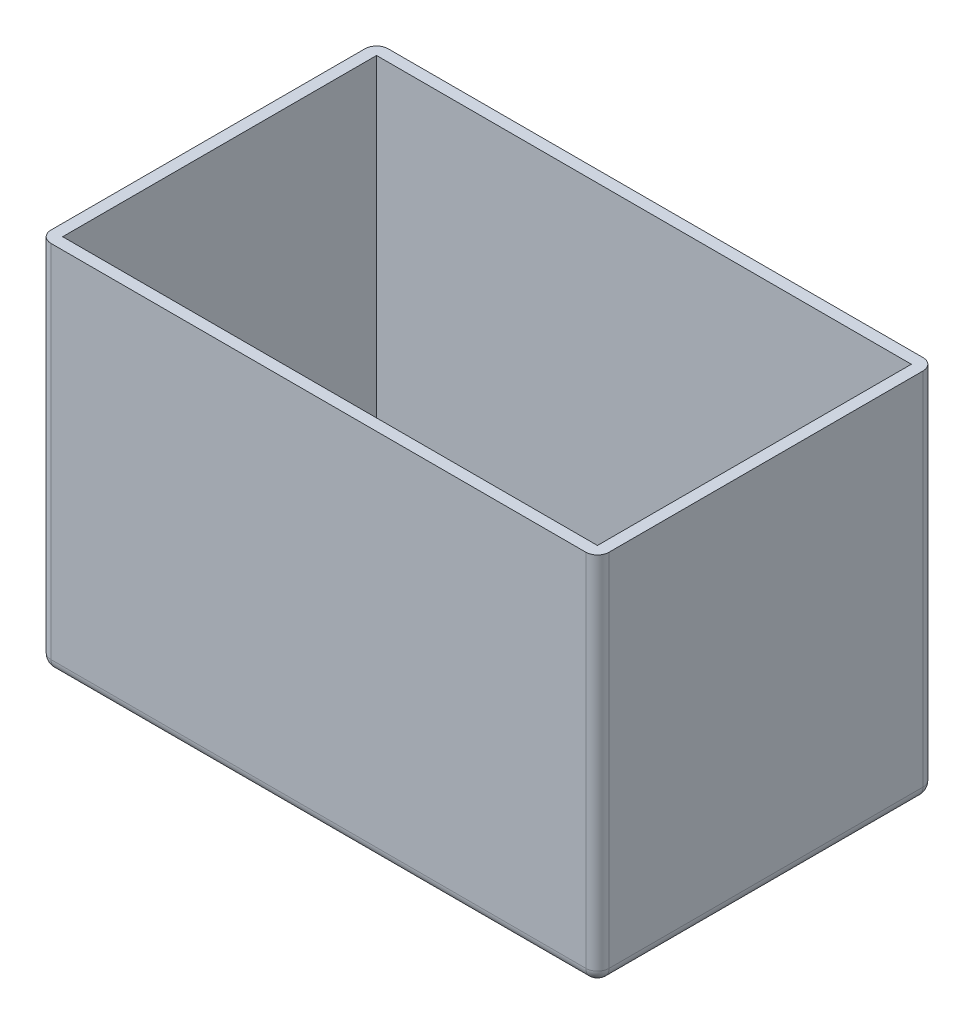
ISO-10303-21;
HEADER;
FILE_DESCRIPTION(('STEP AP214'),'2;1');
FILE_NAME('part.step','',(''),(''),'','','');
FILE_SCHEMA(('AUTOMOTIVE_DESIGN { 1 0 10303 214 1 1 1 1 }'));
ENDSEC;
DATA;
#1=APPLICATION_CONTEXT('core data for automotive mechanical design processes');
#2=APPLICATION_PROTOCOL_DEFINITION('international standard','automotive_design',2000,#1);
#3=PRODUCT_CONTEXT('',#1,'mechanical');
#4=PRODUCT('Part','Part','',(#3));
#5=PRODUCT_RELATED_PRODUCT_CATEGORY('part','',(#4));
#6=PRODUCT_DEFINITION_FORMATION('','',#4);
#7=PRODUCT_DEFINITION_CONTEXT('part definition',#1,'design');
#8=PRODUCT_DEFINITION('design','',#6,#7);
#9=PRODUCT_DEFINITION_SHAPE('','',#8);
#10=(LENGTH_UNIT() NAMED_UNIT(*) SI_UNIT(.MILLI.,.METRE.));
#11=(NAMED_UNIT(*) PLANE_ANGLE_UNIT() SI_UNIT($,.RADIAN.));
#12=(NAMED_UNIT(*) SI_UNIT($,.STERADIAN.) SOLID_ANGLE_UNIT());
#13=UNCERTAINTY_MEASURE_WITH_UNIT(LENGTH_MEASURE(1.E-05),#10,'distance_accuracy_value','');
#14=(GEOMETRIC_REPRESENTATION_CONTEXT(3) GLOBAL_UNCERTAINTY_ASSIGNED_CONTEXT((#13)) GLOBAL_UNIT_ASSIGNED_CONTEXT((#10,
#11,#12)) REPRESENTATION_CONTEXT('',''));
#15=CARTESIAN_POINT('',(0.,0.,0.));
#16=DIRECTION('',(0.,0.,1.));
#17=DIRECTION('',(1.,0.,0.));
#18=AXIS2_PLACEMENT_3D('',#15,#16,#17);
#19=CARTESIAN_POINT('',(-32.7097276422764,32.,-26.44775));
#20=DIRECTION('',(1.,0.,0.));
#21=DIRECTION('',(0.,0.,-1.));
#22=AXIS2_PLACEMENT_3D('',#19,#20,#21);
#23=PLANE('',#22);
#24=DIRECTION('',(0.,0.,1.));
#25=VECTOR('',#24,1.);
#26=CARTESIAN_POINT('',(-32.7097276422764,1.,-26.44775));
#27=LINE('',#26,#25);
#28=CARTESIAN_POINT('',(-32.7097276422764,1.,-54.44775));
#29=VERTEX_POINT('',#28);
#30=CARTESIAN_POINT('',(-32.7097276422764,1.,-27.44775));
#31=VERTEX_POINT('',#30);
#32=EDGE_CURVE('E192',#29,#31,#27,.T.);
#33=ORIENTED_EDGE('',*,*,#32,.T.);
#34=DIRECTION('',(0.,-1.,0.));
#35=VECTOR('',#34,1.);
#36=CARTESIAN_POINT('',(-32.7097276422764,32.,-27.44775));
#37=LINE('',#36,#35);
#38=CARTESIAN_POINT('',(-32.7097276422764,32.,-27.44775));
#39=VERTEX_POINT('',#38);
#40=EDGE_CURVE('E195',#31,#39,#37,.F.);
#41=ORIENTED_EDGE('',*,*,#40,.T.);
#42=DIRECTION('',(0.,0.,1.));
#43=VECTOR('',#42,1.);
#44=CARTESIAN_POINT('',(-32.7097276422764,32.,-26.44775));
#45=LINE('',#44,#43);
#46=CARTESIAN_POINT('',(-32.7097276422764,32.,-54.44775));
#47=VERTEX_POINT('',#46);
#48=EDGE_CURVE('E175',#47,#39,#45,.T.);
#49=ORIENTED_EDGE('',*,*,#48,.F.);
#50=DIRECTION('',(0.,-1.,0.));
#51=VECTOR('',#50,1.);
#52=CARTESIAN_POINT('',(-32.7097276422764,32.,-54.44775));
#53=LINE('',#52,#51);
#54=EDGE_CURVE('E190',#47,#29,#53,.T.);
#55=ORIENTED_EDGE('',*,*,#54,.T.);
#56=EDGE_LOOP('',(#33,#41,#49,#55));
#57=FACE_BOUND('',#56,.T.);
#58=ADVANCED_FACE('F33',(#57),#23,.F.);
#59=CARTESIAN_POINT('',(-32.7097276422764,32.,-26.44775));
#60=DIRECTION('',(0.,0.,-1.));
#61=DIRECTION('',(-1.,0.,0.));
#62=AXIS2_PLACEMENT_3D('',#59,#60,#61);
#63=PLANE('',#62);
#64=DIRECTION('',(1.,0.,0.));
#65=VECTOR('',#64,1.);
#66=CARTESIAN_POINT('',(15.2902723577236,1.,-26.44775));
#67=LINE('',#66,#65);
#68=CARTESIAN_POINT('',(-31.7097276422764,1.,-26.44775));
#69=VERTEX_POINT('',#68);
#70=CARTESIAN_POINT('',(14.2902723577236,1.,-26.44775));
#71=VERTEX_POINT('',#70);
#72=EDGE_CURVE('E50',#69,#71,#67,.T.);
#73=ORIENTED_EDGE('',*,*,#72,.T.);
#74=DIRECTION('',(0.,-1.,0.));
#75=VECTOR('',#74,1.);
#76=CARTESIAN_POINT('',(14.2902723577236,32.,-26.44775));
#77=LINE('',#76,#75);
#78=CARTESIAN_POINT('',(14.2902723577236,32.,-26.44775));
#79=VERTEX_POINT('',#78);
#80=EDGE_CURVE('E220',#71,#79,#77,.F.);
#81=ORIENTED_EDGE('',*,*,#80,.T.);
#82=DIRECTION('',(1.,0.,0.));
#83=VECTOR('',#82,1.);
#84=CARTESIAN_POINT('',(-32.7097276422764,32.,-26.44775));
#85=LINE('',#84,#83);
#86=CARTESIAN_POINT('',(-31.7097276422764,32.,-26.44775));
#87=VERTEX_POINT('',#86);
#88=EDGE_CURVE('E181',#87,#79,#85,.T.);
#89=ORIENTED_EDGE('',*,*,#88,.F.);
#90=DIRECTION('',(0.,-1.,0.));
#91=VECTOR('',#90,1.);
#92=CARTESIAN_POINT('',(-31.7097276422764,32.,-26.44775));
#93=LINE('',#92,#91);
#94=EDGE_CURVE('E55',#87,#69,#93,.T.);
#95=ORIENTED_EDGE('',*,*,#94,.T.);
#96=EDGE_LOOP('',(#73,#81,#89,#95));
#97=FACE_BOUND('',#96,.T.);
#98=ADVANCED_FACE('F293',(#97),#63,.F.);
#99=CARTESIAN_POINT('',(15.2902723577236,32.,-26.44775));
#100=DIRECTION('',(-1.,0.,0.));
#101=DIRECTION('',(0.,0.,1.));
#102=AXIS2_PLACEMENT_3D('',#99,#100,#101);
#103=PLANE('',#102);
#104=DIRECTION('',(0.,0.,-1.));
#105=VECTOR('',#104,1.);
#106=CARTESIAN_POINT('',(15.2902723577236,32.,-26.44775));
#107=LINE('',#106,#105);
#108=CARTESIAN_POINT('',(15.2902723577236,32.,-27.44775));
#109=VERTEX_POINT('',#108);
#110=CARTESIAN_POINT('',(15.2902723577236,32.,-54.44775));
#111=VERTEX_POINT('',#110);
#112=EDGE_CURVE('E184',#109,#111,#107,.T.);
#113=ORIENTED_EDGE('',*,*,#112,.F.);
#114=DIRECTION('',(0.,-1.,0.));
#115=VECTOR('',#114,1.);
#116=CARTESIAN_POINT('',(15.2902723577236,32.,-27.44775));
#117=LINE('',#116,#115);
#118=CARTESIAN_POINT('',(15.2902723577236,1.,-27.44775));
#119=VERTEX_POINT('',#118);
#120=EDGE_CURVE('E216',#109,#119,#117,.T.);
#121=ORIENTED_EDGE('',*,*,#120,.T.);
#122=DIRECTION('',(0.,0.,-1.));
#123=VECTOR('',#122,1.);
#124=CARTESIAN_POINT('',(15.2902723577236,1.,-55.44775));
#125=LINE('',#124,#123);
#126=CARTESIAN_POINT('',(15.2902723577236,1.,-54.44775));
#127=VERTEX_POINT('',#126);
#128=EDGE_CURVE('E214',#119,#127,#125,.T.);
#129=ORIENTED_EDGE('',*,*,#128,.T.);
#130=DIRECTION('',(0.,-1.,0.));
#131=VECTOR('',#130,1.);
#132=CARTESIAN_POINT('',(15.2902723577236,32.,-54.44775));
#133=LINE('',#132,#131);
#134=EDGE_CURVE('E212',#127,#111,#133,.F.);
#135=ORIENTED_EDGE('',*,*,#134,.T.);
#136=EDGE_LOOP('',(#113,#121,#129,#135));
#137=FACE_BOUND('',#136,.T.);
#138=ADVANCED_FACE('F313',(#137),#103,.F.);
#139=CARTESIAN_POINT('',(-32.7097276422764,32.,-55.44775));
#140=DIRECTION('',(0.,0.,1.));
#141=DIRECTION('',(1.,0.,0.));
#142=AXIS2_PLACEMENT_3D('',#139,#140,#141);
#143=PLANE('',#142);
#144=DIRECTION('',(-1.,0.,0.));
#145=VECTOR('',#144,1.);
#146=CARTESIAN_POINT('',(-32.7097276422764,32.,-55.44775));
#147=LINE('',#146,#145);
#148=CARTESIAN_POINT('',(14.2902723577236,32.,-55.44775));
#149=VERTEX_POINT('',#148);
#150=CARTESIAN_POINT('',(-31.7097276422764,32.,-55.44775));
#151=VERTEX_POINT('',#150);
#152=EDGE_CURVE('E187',#149,#151,#147,.T.);
#153=ORIENTED_EDGE('',*,*,#152,.F.);
#154=DIRECTION('',(0.,-1.,0.));
#155=VECTOR('',#154,1.);
#156=CARTESIAN_POINT('',(14.2902723577236,32.,-55.44775));
#157=LINE('',#156,#155);
#158=CARTESIAN_POINT('',(14.2902723577236,1.,-55.44775));
#159=VERTEX_POINT('',#158);
#160=EDGE_CURVE('E210',#149,#159,#157,.T.);
#161=ORIENTED_EDGE('',*,*,#160,.T.);
#162=DIRECTION('',(-1.,0.,0.));
#163=VECTOR('',#162,1.);
#164=CARTESIAN_POINT('',(-32.7097276422764,1.,-55.44775));
#165=LINE('',#164,#163);
#166=CARTESIAN_POINT('',(-31.7097276422764,1.,-55.44775));
#167=VERTEX_POINT('',#166);
#168=EDGE_CURVE('E208',#159,#167,#165,.T.);
#169=ORIENTED_EDGE('',*,*,#168,.T.);
#170=DIRECTION('',(0.,-1.,0.));
#171=VECTOR('',#170,1.);
#172=CARTESIAN_POINT('',(-31.7097276422764,32.,-55.44775));
#173=LINE('',#172,#171);
#174=EDGE_CURVE('E206',#167,#151,#173,.F.);
#175=ORIENTED_EDGE('',*,*,#174,.T.);
#176=EDGE_LOOP('',(#153,#161,#169,#175));
#177=FACE_BOUND('',#176,.T.);
#178=ADVANCED_FACE('F274',(#177),#143,.F.);
#179=CARTESIAN_POINT('',(0.,32.,0.));
#180=DIRECTION('',(0.,-1.,0.));
#181=DIRECTION('',(0.,0.,-1.));
#182=AXIS2_PLACEMENT_3D('',#179,#180,#181);
#183=PLANE('',#182);
#184=DIRECTION('',(1.,0.,0.));
#185=VECTOR('',#184,1.);
#186=CARTESIAN_POINT('',(-31.7097276422764,32.,-27.44775));
#187=LINE('',#186,#185);
#188=CARTESIAN_POINT('',(-31.7097276422764,32.,-27.44775));
#189=VERTEX_POINT('',#188);
#190=CARTESIAN_POINT('',(14.2902723577236,32.,-27.44775));
#191=VERTEX_POINT('',#190);
#192=EDGE_CURVE('E169',#189,#191,#187,.T.);
#193=ORIENTED_EDGE('',*,*,#192,.F.);
#194=DIRECTION('',(0.,0.,1.));
#195=VECTOR('',#194,1.);
#196=CARTESIAN_POINT('',(-31.7097276422764,32.,-54.44775));
#197=LINE('',#196,#195);
#198=CARTESIAN_POINT('',(-31.7097276422764,32.,-54.44775));
#199=VERTEX_POINT('',#198);
#200=EDGE_CURVE('E140',#199,#189,#197,.T.);
#201=ORIENTED_EDGE('',*,*,#200,.F.);
#202=DIRECTION('',(1.,0.,0.));
#203=VECTOR('',#202,1.);
#204=CARTESIAN_POINT('',(-31.7097276422764,32.,-54.44775));
#205=LINE('',#204,#203);
#206=CARTESIAN_POINT('',(14.2902723577236,32.,-54.44775));
#207=VERTEX_POINT('',#206);
#208=EDGE_CURVE('E157',#199,#207,#205,.T.);
#209=ORIENTED_EDGE('',*,*,#208,.T.);
#210=DIRECTION('',(0.,0.,1.));
#211=VECTOR('',#210,1.);
#212=CARTESIAN_POINT('',(14.2902723577236,32.,-54.44775));
#213=LINE('',#212,#211);
#214=EDGE_CURVE('E160',#207,#191,#213,.T.);
#215=ORIENTED_EDGE('',*,*,#214,.T.);
#216=EDGE_LOOP('',(#193,#201,#209,#215));
#217=FACE_BOUND('',#216,.T.);
#218=ORIENTED_EDGE('',*,*,#88,.T.);
#219=CARTESIAN_POINT('',(14.2902723577236,32.,-27.44775));
#220=DIRECTION('',(0.,-1.,0.));
#221=DIRECTION('',(0.,0.,-1.));
#222=AXIS2_PLACEMENT_3D('',#219,#220,#221);
#223=CIRCLE('',#222,1.);
#224=EDGE_CURVE('E11',#79,#109,#223,.F.);
#225=ORIENTED_EDGE('',*,*,#224,.T.);
#226=ORIENTED_EDGE('',*,*,#112,.T.);
#227=CARTESIAN_POINT('',(14.2902723577236,32.,-54.44775));
#228=DIRECTION('',(0.,-1.,0.));
#229=DIRECTION('',(0.,0.,-1.));
#230=AXIS2_PLACEMENT_3D('',#227,#228,#229);
#231=CIRCLE('',#230,1.);
#232=EDGE_CURVE('E42',#111,#149,#231,.F.);
#233=ORIENTED_EDGE('',*,*,#232,.T.);
#234=ORIENTED_EDGE('',*,*,#152,.T.);
#235=CARTESIAN_POINT('',(-31.7097276422764,32.,-54.44775));
#236=DIRECTION('',(0.,-1.,0.));
#237=DIRECTION('',(0.,0.,-1.));
#238=AXIS2_PLACEMENT_3D('',#235,#236,#237);
#239=CIRCLE('',#238,1.);
#240=EDGE_CURVE('E222',#151,#47,#239,.F.);
#241=ORIENTED_EDGE('',*,*,#240,.T.);
#242=ORIENTED_EDGE('',*,*,#48,.T.);
#243=CARTESIAN_POINT('',(-31.7097276422764,32.,-27.44775));
#244=DIRECTION('',(0.,-1.,0.));
#245=DIRECTION('',(0.,0.,-1.));
#246=AXIS2_PLACEMENT_3D('',#243,#244,#245);
#247=CIRCLE('',#246,1.);
#248=EDGE_CURVE('E224',#39,#87,#247,.F.);
#249=ORIENTED_EDGE('',*,*,#248,.T.);
#250=EDGE_LOOP('',(#218,#225,#226,#233,#234,#241,#242,#249));
#251=FACE_BOUND('',#250,.T.);
#252=ADVANCED_FACE('F284',(#217,#251),#183,.F.);
#253=CARTESIAN_POINT('',(0.,0.,0.));
#254=DIRECTION('',(0.,-1.,0.));
#255=DIRECTION('',(0.,0.,-1.));
#256=AXIS2_PLACEMENT_3D('',#253,#254,#255);
#257=PLANE('',#256);
#258=CARTESIAN_POINT('',(-22.3397276421179,0.,-44.3466535810173));
#259=DIRECTION('',(0.,-1.,0.));
#260=DIRECTION('',(0.,0.,-1.));
#261=AXIS2_PLACEMENT_3D('',#258,#259,#260);
#262=CIRCLE('',#261,8.);
#263=CARTESIAN_POINT('',(-22.3397276421179,0.,-52.3466535810173));
#264=VERTEX_POINT('',#263);
#265=EDGE_CURVE('E537',#264,#264,#262,.T.);
#266=ORIENTED_EDGE('',*,*,#265,.F.);
#267=EDGE_LOOP('',(#266));
#268=FACE_BOUND('',#267,.T.);
#269=CARTESIAN_POINT('',(3.26027235772358,0.,-44.3465635044533));
#270=DIRECTION('',(0.,-1.,0.));
#271=DIRECTION('',(0.,0.,-1.));
#272=AXIS2_PLACEMENT_3D('',#269,#270,#271);
#273=CIRCLE('',#272,8.);
#274=CARTESIAN_POINT('',(3.26027235772358,0.,-52.3465635044533));
#275=VERTEX_POINT('',#274);
#276=EDGE_CURVE('E163',#275,#275,#273,.T.);
#277=ORIENTED_EDGE('',*,*,#276,.F.);
#278=EDGE_LOOP('',(#277));
#279=FACE_BOUND('',#278,.T.);
#280=DIRECTION('',(1.,0.,0.));
#281=VECTOR('',#280,1.);
#282=CARTESIAN_POINT('',(-32.7097276422764,0.,-27.44775));
#283=LINE('',#282,#281);
#284=CARTESIAN_POINT('',(14.2902723577236,0.,-27.44775));
#285=VERTEX_POINT('',#284);
#286=CARTESIAN_POINT('',(-31.7097276422764,0.,-27.44775));
#287=VERTEX_POINT('',#286);
#288=EDGE_CURVE('E197',#285,#287,#283,.F.);
#289=ORIENTED_EDGE('',*,*,#288,.T.);
#290=DIRECTION('',(0.,0.,1.));
#291=VECTOR('',#290,1.);
#292=CARTESIAN_POINT('',(-31.7097276422764,0.,-55.44775));
#293=LINE('',#292,#291);
#294=CARTESIAN_POINT('',(-31.7097276422764,0.,-54.44775));
#295=VERTEX_POINT('',#294);
#296=EDGE_CURVE('E203',#287,#295,#293,.F.);
#297=ORIENTED_EDGE('',*,*,#296,.T.);
#298=DIRECTION('',(-1.,0.,0.));
#299=VECTOR('',#298,1.);
#300=CARTESIAN_POINT('',(15.2902723577236,0.,-54.44775));
#301=LINE('',#300,#299);
#302=CARTESIAN_POINT('',(14.2902723577236,0.,-54.44775));
#303=VERTEX_POINT('',#302);
#304=EDGE_CURVE('E201',#295,#303,#301,.F.);
#305=ORIENTED_EDGE('',*,*,#304,.T.);
#306=DIRECTION('',(0.,0.,-1.));
#307=VECTOR('',#306,1.);
#308=CARTESIAN_POINT('',(14.2902723577236,0.,-26.44775));
#309=LINE('',#308,#307);
#310=EDGE_CURVE('E199',#303,#285,#309,.F.);
#311=ORIENTED_EDGE('',*,*,#310,.T.);
#312=EDGE_LOOP('',(#289,#297,#305,#311));
#313=FACE_BOUND('',#312,.T.);
#314=ADVANCED_FACE('F308',(#268,#279,#313),#257,.T.);
#315=CARTESIAN_POINT('',(-31.7097276422764,1.,-54.44775));
#316=DIRECTION('',(-1.,0.,0.));
#317=DIRECTION('',(0.,0.,1.));
#318=AXIS2_PLACEMENT_3D('',#315,#316,#317);
#319=PLANE('',#318);
#320=ORIENTED_EDGE('',*,*,#200,.T.);
#321=DIRECTION('',(0.,1.,0.));
#322=VECTOR('',#321,1.);
#323=CARTESIAN_POINT('',(-31.7097276422764,1.,-27.44775));
#324=LINE('',#323,#322);
#325=CARTESIAN_POINT('',(-31.7097276422764,1.,-27.44775));
#326=VERTEX_POINT('',#325);
#327=EDGE_CURVE('E134',#326,#189,#324,.T.);
#328=ORIENTED_EDGE('',*,*,#327,.F.);
#329=DIRECTION('',(0.,0.,1.));
#330=VECTOR('',#329,1.);
#331=CARTESIAN_POINT('',(-31.7097276422764,1.,-54.44775));
#332=LINE('',#331,#330);
#333=CARTESIAN_POINT('',(-31.7097276422764,1.,-54.44775));
#334=VERTEX_POINT('',#333);
#335=EDGE_CURVE('E138',#334,#326,#332,.T.);
#336=ORIENTED_EDGE('',*,*,#335,.F.);
#337=DIRECTION('',(0.,1.,0.));
#338=VECTOR('',#337,1.);
#339=CARTESIAN_POINT('',(-31.7097276422764,1.,-54.44775));
#340=LINE('',#339,#338);
#341=EDGE_CURVE('E173',#334,#199,#340,.T.);
#342=ORIENTED_EDGE('',*,*,#341,.T.);
#343=EDGE_LOOP('',(#320,#328,#336,#342));
#344=FACE_BOUND('',#343,.T.);
#345=ADVANCED_FACE('F136',(#344),#319,.F.);
#346=CARTESIAN_POINT('',(-31.7097276422764,1.,-54.44775));
#347=DIRECTION('',(0.,0.,1.));
#348=DIRECTION('',(1.,0.,0.));
#349=AXIS2_PLACEMENT_3D('',#346,#347,#348);
#350=PLANE('',#349);
#351=ORIENTED_EDGE('',*,*,#208,.F.);
#352=ORIENTED_EDGE('',*,*,#341,.F.);
#353=DIRECTION('',(1.,0.,0.));
#354=VECTOR('',#353,1.);
#355=CARTESIAN_POINT('',(-31.7097276422764,1.,-54.44775));
#356=LINE('',#355,#354);
#357=CARTESIAN_POINT('',(14.2902723577236,1.,-54.44775));
#358=VERTEX_POINT('',#357);
#359=EDGE_CURVE('E145',#334,#358,#356,.T.);
#360=ORIENTED_EDGE('',*,*,#359,.T.);
#361=DIRECTION('',(0.,1.,0.));
#362=VECTOR('',#361,1.);
#363=CARTESIAN_POINT('',(14.2902723577236,1.,-54.44775));
#364=LINE('',#363,#362);
#365=EDGE_CURVE('E176',#358,#207,#364,.T.);
#366=ORIENTED_EDGE('',*,*,#365,.T.);
#367=EDGE_LOOP('',(#351,#352,#360,#366));
#368=FACE_BOUND('',#367,.T.);
#369=ADVANCED_FACE('F467',(#368),#350,.T.);
#370=CARTESIAN_POINT('',(14.2902723577236,1.,-54.44775));
#371=DIRECTION('',(-1.,0.,0.));
#372=DIRECTION('',(0.,0.,1.));
#373=AXIS2_PLACEMENT_3D('',#370,#371,#372);
#374=PLANE('',#373);
#375=ORIENTED_EDGE('',*,*,#214,.F.);
#376=ORIENTED_EDGE('',*,*,#365,.F.);
#377=DIRECTION('',(0.,0.,1.));
#378=VECTOR('',#377,1.);
#379=CARTESIAN_POINT('',(14.2902723577236,1.,-54.44775));
#380=LINE('',#379,#378);
#381=CARTESIAN_POINT('',(14.2902723577236,1.,-27.44775));
#382=VERTEX_POINT('',#381);
#383=EDGE_CURVE('E153',#358,#382,#380,.T.);
#384=ORIENTED_EDGE('',*,*,#383,.T.);
#385=DIRECTION('',(0.,1.,0.));
#386=VECTOR('',#385,1.);
#387=CARTESIAN_POINT('',(14.2902723577236,1.,-27.44775));
#388=LINE('',#387,#386);
#389=EDGE_CURVE('E144',#382,#191,#388,.T.);
#390=ORIENTED_EDGE('',*,*,#389,.T.);
#391=EDGE_LOOP('',(#375,#376,#384,#390));
#392=FACE_BOUND('',#391,.T.);
#393=ADVANCED_FACE('F459',(#392),#374,.T.);
#394=CARTESIAN_POINT('',(-31.7097276422764,1.,-27.44775));
#395=DIRECTION('',(0.,0.,1.));
#396=DIRECTION('',(1.,0.,0.));
#397=AXIS2_PLACEMENT_3D('',#394,#395,#396);
#398=PLANE('',#397);
#399=ORIENTED_EDGE('',*,*,#192,.T.);
#400=ORIENTED_EDGE('',*,*,#389,.F.);
#401=DIRECTION('',(1.,0.,0.));
#402=VECTOR('',#401,1.);
#403=CARTESIAN_POINT('',(-31.7097276422764,1.,-27.44775));
#404=LINE('',#403,#402);
#405=EDGE_CURVE('E149',#326,#382,#404,.T.);
#406=ORIENTED_EDGE('',*,*,#405,.F.);
#407=ORIENTED_EDGE('',*,*,#327,.T.);
#408=EDGE_LOOP('',(#399,#400,#406,#407));
#409=FACE_BOUND('',#408,.T.);
#410=ADVANCED_FACE('F150',(#409),#398,.F.);
#411=CARTESIAN_POINT('',(0.,1.,0.));
#412=DIRECTION('',(0.,1.,0.));
#413=DIRECTION('',(0.,0.,1.));
#414=AXIS2_PLACEMENT_3D('',#411,#412,#413);
#415=PLANE('',#414);
#416=CARTESIAN_POINT('',(-22.3397276421179,1.,-44.3466535810173));
#417=DIRECTION('',(0.,-1.,0.));
#418=DIRECTION('',(0.,0.,-1.));
#419=AXIS2_PLACEMENT_3D('',#416,#417,#418);
#420=CIRCLE('',#419,8.);
#421=CARTESIAN_POINT('',(-22.3397276421179,1.,-52.3466535810173));
#422=VERTEX_POINT('',#421);
#423=EDGE_CURVE('E541',#422,#422,#420,.T.);
#424=ORIENTED_EDGE('',*,*,#423,.T.);
#425=EDGE_LOOP('',(#424));
#426=FACE_BOUND('',#425,.T.);
#427=CARTESIAN_POINT('',(3.26027235772358,1.,-44.3465635044533));
#428=DIRECTION('',(0.,-1.,0.));
#429=DIRECTION('',(0.,0.,-1.));
#430=AXIS2_PLACEMENT_3D('',#427,#428,#429);
#431=CIRCLE('',#430,8.);
#432=CARTESIAN_POINT('',(3.26027235772358,1.,-52.3465635044533));
#433=VERTEX_POINT('',#432);
#434=EDGE_CURVE('E230',#433,#433,#431,.T.);
#435=ORIENTED_EDGE('',*,*,#434,.T.);
#436=EDGE_LOOP('',(#435));
#437=FACE_BOUND('',#436,.T.);
#438=ORIENTED_EDGE('',*,*,#335,.T.);
#439=ORIENTED_EDGE('',*,*,#405,.T.);
#440=ORIENTED_EDGE('',*,*,#383,.F.);
#441=ORIENTED_EDGE('',*,*,#359,.F.);
#442=EDGE_LOOP('',(#438,#439,#440,#441));
#443=FACE_BOUND('',#442,.T.);
#444=ADVANCED_FACE('F156',(#426,#437,#443),#415,.T.);
#445=CARTESIAN_POINT('',(14.2902723577236,32.,-54.44775));
#446=DIRECTION('',(0.,-1.,0.));
#447=DIRECTION('',(0.,0.,-1.));
#448=AXIS2_PLACEMENT_3D('',#445,#446,#447);
#449=CYLINDRICAL_SURFACE('',#448,1.);
#450=ORIENTED_EDGE('',*,*,#232,.F.);
#451=ORIENTED_EDGE('',*,*,#134,.F.);
#452=CARTESIAN_POINT('',(14.2902723577236,1.,-54.44775));
#453=DIRECTION('',(0.,-1.,0.));
#454=DIRECTION('',(0.,0.,-1.));
#455=AXIS2_PLACEMENT_3D('',#452,#453,#454);
#456=CIRCLE('',#455,1.);
#457=EDGE_CURVE('E255',#159,#127,#456,.T.);
#458=ORIENTED_EDGE('',*,*,#457,.F.);
#459=ORIENTED_EDGE('',*,*,#160,.F.);
#460=EDGE_LOOP('',(#450,#451,#458,#459));
#461=FACE_BOUND('',#460,.T.);
#462=ADVANCED_FACE('F35',(#461),#449,.T.);
#463=CARTESIAN_POINT('',(14.2902723577236,32.,-27.44775));
#464=DIRECTION('',(0.,-1.,0.));
#465=DIRECTION('',(0.,0.,-1.));
#466=AXIS2_PLACEMENT_3D('',#463,#464,#465);
#467=CYLINDRICAL_SURFACE('',#466,1.);
#468=ORIENTED_EDGE('',*,*,#224,.F.);
#469=ORIENTED_EDGE('',*,*,#80,.F.);
#470=CARTESIAN_POINT('',(14.2902723577236,1.,-27.44775));
#471=DIRECTION('',(0.,-1.,0.));
#472=DIRECTION('',(0.,0.,-1.));
#473=AXIS2_PLACEMENT_3D('',#470,#471,#472);
#474=CIRCLE('',#473,1.);
#475=EDGE_CURVE('E253',#119,#71,#474,.T.);
#476=ORIENTED_EDGE('',*,*,#475,.F.);
#477=ORIENTED_EDGE('',*,*,#120,.F.);
#478=EDGE_LOOP('',(#468,#469,#476,#477));
#479=FACE_BOUND('',#478,.T.);
#480=ADVANCED_FACE('F296',(#479),#467,.T.);
#481=CARTESIAN_POINT('',(14.2902723577236,1.,-26.44775));
#482=DIRECTION('',(0.,0.,1.));
#483=DIRECTION('',(1.,0.,0.));
#484=AXIS2_PLACEMENT_3D('',#481,#482,#483);
#485=CYLINDRICAL_SURFACE('',#484,1.);
#486=CARTESIAN_POINT('',(14.2902723577236,1.,-54.44775));
#487=DIRECTION('',(0.,0.,-1.));
#488=DIRECTION('',(-1.,0.,0.));
#489=AXIS2_PLACEMENT_3D('',#486,#487,#488);
#490=CIRCLE('',#489,1.);
#491=EDGE_CURVE('E37',#127,#303,#490,.T.);
#492=ORIENTED_EDGE('',*,*,#491,.F.);
#493=ORIENTED_EDGE('',*,*,#128,.F.);
#494=CARTESIAN_POINT('',(14.2902723577236,1.,-27.44775));
#495=DIRECTION('',(0.,0.,1.));
#496=DIRECTION('',(1.,0.,0.));
#497=AXIS2_PLACEMENT_3D('',#494,#495,#496);
#498=CIRCLE('',#497,1.);
#499=EDGE_CURVE('E250',#285,#119,#498,.T.);
#500=ORIENTED_EDGE('',*,*,#499,.F.);
#501=ORIENTED_EDGE('',*,*,#310,.F.);
#502=EDGE_LOOP('',(#492,#493,#500,#501));
#503=FACE_BOUND('',#502,.T.);
#504=ADVANCED_FACE('F309',(#503),#485,.T.);
#505=CARTESIAN_POINT('',(14.2902723577236,1.,-54.44775));
#506=DIRECTION('',(0.,0.,1.));
#507=DIRECTION('',(1.,0.,0.));
#508=AXIS2_PLACEMENT_3D('',#505,#506,#507);
#509=SPHERICAL_SURFACE('',#508,1.);
#510=ORIENTED_EDGE('',*,*,#457,.T.);
#511=ORIENTED_EDGE('',*,*,#491,.T.);
#512=CARTESIAN_POINT('',(14.2902723577236,1.,-54.44775));
#513=DIRECTION('',(1.,0.,0.));
#514=DIRECTION('',(0.,0.,-1.));
#515=AXIS2_PLACEMENT_3D('',#512,#513,#514);
#516=CIRCLE('',#515,1.);
#517=EDGE_CURVE('E247',#159,#303,#516,.F.);
#518=ORIENTED_EDGE('',*,*,#517,.F.);
#519=EDGE_LOOP('',(#510,#511,#518));
#520=FACE_BOUND('',#519,.T.);
#521=ADVANCED_FACE('F262',(#520),#509,.T.);
#522=CARTESIAN_POINT('',(14.2902723577236,1.,-27.44775));
#523=DIRECTION('',(0.,0.,1.));
#524=DIRECTION('',(1.,0.,0.));
#525=AXIS2_PLACEMENT_3D('',#522,#523,#524);
#526=SPHERICAL_SURFACE('',#525,1.);
#527=ORIENTED_EDGE('',*,*,#499,.T.);
#528=ORIENTED_EDGE('',*,*,#475,.T.);
#529=CARTESIAN_POINT('',(14.2902723577236,1.,-27.44775));
#530=DIRECTION('',(1.,0.,0.));
#531=DIRECTION('',(0.,0.,-1.));
#532=AXIS2_PLACEMENT_3D('',#529,#530,#531);
#533=CIRCLE('',#532,1.);
#534=EDGE_CURVE('E244',#285,#71,#533,.F.);
#535=ORIENTED_EDGE('',*,*,#534,.F.);
#536=EDGE_LOOP('',(#527,#528,#535));
#537=FACE_BOUND('',#536,.T.);
#538=ADVANCED_FACE('F300',(#537),#526,.T.);
#539=CARTESIAN_POINT('',(-32.7097276422764,1.,-54.44775));
#540=DIRECTION('',(1.,0.,0.));
#541=DIRECTION('',(0.,0.,-1.));
#542=AXIS2_PLACEMENT_3D('',#539,#540,#541);
#543=CYLINDRICAL_SURFACE('',#542,1.);
#544=ORIENTED_EDGE('',*,*,#517,.T.);
#545=ORIENTED_EDGE('',*,*,#304,.F.);
#546=CARTESIAN_POINT('',(-31.7097276422764,1.,-54.44775));
#547=DIRECTION('',(-1.,0.,0.));
#548=DIRECTION('',(0.,0.,1.));
#549=AXIS2_PLACEMENT_3D('',#546,#547,#548);
#550=CIRCLE('',#549,1.);
#551=EDGE_CURVE('E241',#167,#295,#550,.T.);
#552=ORIENTED_EDGE('',*,*,#551,.F.);
#553=ORIENTED_EDGE('',*,*,#168,.F.);
#554=EDGE_LOOP('',(#544,#545,#552,#553));
#555=FACE_BOUND('',#554,.T.);
#556=ADVANCED_FACE('F269',(#555),#543,.T.);
#557=CARTESIAN_POINT('',(-31.7097276422764,32.,-54.44775));
#558=DIRECTION('',(0.,-1.,0.));
#559=DIRECTION('',(0.,0.,-1.));
#560=AXIS2_PLACEMENT_3D('',#557,#558,#559);
#561=CYLINDRICAL_SURFACE('',#560,1.);
#562=ORIENTED_EDGE('',*,*,#240,.F.);
#563=ORIENTED_EDGE('',*,*,#174,.F.);
#564=CARTESIAN_POINT('',(-31.7097276422764,1.,-54.44775));
#565=DIRECTION('',(0.,-1.,0.));
#566=DIRECTION('',(0.,0.,-1.));
#567=AXIS2_PLACEMENT_3D('',#564,#565,#566);
#568=CIRCLE('',#567,1.);
#569=EDGE_CURVE('E238',#29,#167,#568,.T.);
#570=ORIENTED_EDGE('',*,*,#569,.F.);
#571=ORIENTED_EDGE('',*,*,#54,.F.);
#572=EDGE_LOOP('',(#562,#563,#570,#571));
#573=FACE_BOUND('',#572,.T.);
#574=ADVANCED_FACE('F279',(#573),#561,.T.);
#575=CARTESIAN_POINT('',(-31.7097276422764,32.,-27.44775));
#576=DIRECTION('',(0.,-1.,0.));
#577=DIRECTION('',(0.,0.,-1.));
#578=AXIS2_PLACEMENT_3D('',#575,#576,#577);
#579=CYLINDRICAL_SURFACE('',#578,1.);
#580=ORIENTED_EDGE('',*,*,#248,.F.);
#581=ORIENTED_EDGE('',*,*,#40,.F.);
#582=CARTESIAN_POINT('',(-31.7097276422764,1.,-27.44775));
#583=DIRECTION('',(0.,-1.,0.));
#584=DIRECTION('',(0.,0.,-1.));
#585=AXIS2_PLACEMENT_3D('',#582,#583,#584);
#586=CIRCLE('',#585,1.);
#587=EDGE_CURVE('E235',#69,#31,#586,.T.);
#588=ORIENTED_EDGE('',*,*,#587,.F.);
#589=ORIENTED_EDGE('',*,*,#94,.F.);
#590=EDGE_LOOP('',(#580,#581,#588,#589));
#591=FACE_BOUND('',#590,.T.);
#592=ADVANCED_FACE('F291',(#591),#579,.T.);
#593=CARTESIAN_POINT('',(-32.7097276422764,1.,-27.44775));
#594=DIRECTION('',(-1.,0.,0.));
#595=DIRECTION('',(0.,0.,1.));
#596=AXIS2_PLACEMENT_3D('',#593,#594,#595);
#597=CYLINDRICAL_SURFACE('',#596,1.);
#598=ORIENTED_EDGE('',*,*,#534,.T.);
#599=ORIENTED_EDGE('',*,*,#72,.F.);
#600=CARTESIAN_POINT('',(-31.7097276422764,1.,-27.44775));
#601=DIRECTION('',(-1.,0.,0.));
#602=DIRECTION('',(0.,0.,1.));
#603=AXIS2_PLACEMENT_3D('',#600,#601,#602);
#604=CIRCLE('',#603,1.);
#605=EDGE_CURVE('E232',#287,#69,#604,.T.);
#606=ORIENTED_EDGE('',*,*,#605,.F.);
#607=ORIENTED_EDGE('',*,*,#288,.F.);
#608=EDGE_LOOP('',(#598,#599,#606,#607));
#609=FACE_BOUND('',#608,.T.);
#610=ADVANCED_FACE('F304',(#609),#597,.T.);
#611=CARTESIAN_POINT('',(-31.7097276422764,1.,-54.44775));
#612=DIRECTION('',(0.,0.,1.));
#613=DIRECTION('',(1.,0.,0.));
#614=AXIS2_PLACEMENT_3D('',#611,#612,#613);
#615=SPHERICAL_SURFACE('',#614,1.);
#616=ORIENTED_EDGE('',*,*,#569,.T.);
#617=ORIENTED_EDGE('',*,*,#551,.T.);
#618=CARTESIAN_POINT('',(-31.7097276422764,1.,-54.44775));
#619=DIRECTION('',(0.,0.,-1.));
#620=DIRECTION('',(-1.,0.,0.));
#621=AXIS2_PLACEMENT_3D('',#618,#619,#620);
#622=CIRCLE('',#621,1.);
#623=EDGE_CURVE('E229',#29,#295,#622,.F.);
#624=ORIENTED_EDGE('',*,*,#623,.F.);
#625=EDGE_LOOP('',(#616,#617,#624));
#626=FACE_BOUND('',#625,.T.);
#627=ADVANCED_FACE('F339',(#626),#615,.T.);
#628=CARTESIAN_POINT('',(-31.7097276422764,1.,-27.44775));
#629=DIRECTION('',(0.,0.,1.));
#630=DIRECTION('',(1.,0.,0.));
#631=AXIS2_PLACEMENT_3D('',#628,#629,#630);
#632=SPHERICAL_SURFACE('',#631,1.);
#633=ORIENTED_EDGE('',*,*,#605,.T.);
#634=ORIENTED_EDGE('',*,*,#587,.T.);
#635=CARTESIAN_POINT('',(-31.7097276422764,1.,-27.44775));
#636=DIRECTION('',(0.,0.,1.));
#637=DIRECTION('',(1.,0.,0.));
#638=AXIS2_PLACEMENT_3D('',#635,#636,#637);
#639=CIRCLE('',#638,1.);
#640=EDGE_CURVE('E227',#287,#31,#639,.F.);
#641=ORIENTED_EDGE('',*,*,#640,.F.);
#642=EDGE_LOOP('',(#633,#634,#641));
#643=FACE_BOUND('',#642,.T.);
#644=ADVANCED_FACE('F335',(#643),#632,.T.);
#645=CARTESIAN_POINT('',(-31.7097276422764,1.,-26.44775));
#646=DIRECTION('',(0.,0.,-1.));
#647=DIRECTION('',(-1.,0.,0.));
#648=AXIS2_PLACEMENT_3D('',#645,#646,#647);
#649=CYLINDRICAL_SURFACE('',#648,1.);
#650=ORIENTED_EDGE('',*,*,#623,.T.);
#651=ORIENTED_EDGE('',*,*,#296,.F.);
#652=ORIENTED_EDGE('',*,*,#640,.T.);
#653=ORIENTED_EDGE('',*,*,#32,.F.);
#654=EDGE_LOOP('',(#650,#651,#652,#653));
#655=FACE_BOUND('',#654,.T.);
#656=ADVANCED_FACE('F331',(#655),#649,.T.);
#657=CARTESIAN_POINT('',(3.26027235772358,1.,-44.3465635044533));
#658=DIRECTION('',(0.,-1.,0.));
#659=DIRECTION('',(0.,0.,-1.));
#660=AXIS2_PLACEMENT_3D('',#657,#658,#659);
#661=CYLINDRICAL_SURFACE('',#660,8.);
#662=ORIENTED_EDGE('',*,*,#434,.F.);
#663=EDGE_LOOP('',(#662));
#664=FACE_BOUND('',#663,.T.);
#665=ORIENTED_EDGE('',*,*,#276,.T.);
#666=EDGE_LOOP('',(#665));
#667=FACE_BOUND('',#666,.T.);
#668=ADVANCED_FACE('F334',(#664,#667),#661,.F.);
#669=CARTESIAN_POINT('',(-22.3397276421179,1.,-44.3466535810173));
#670=DIRECTION('',(0.,-1.,0.));
#671=DIRECTION('',(0.,0.,-1.));
#672=AXIS2_PLACEMENT_3D('',#669,#670,#671);
#673=CYLINDRICAL_SURFACE('',#672,8.);
#674=ORIENTED_EDGE('',*,*,#423,.F.);
#675=EDGE_LOOP('',(#674));
#676=FACE_BOUND('',#675,.T.);
#677=ORIENTED_EDGE('',*,*,#265,.T.);
#678=EDGE_LOOP('',(#677));
#679=FACE_BOUND('',#678,.T.);
#680=ADVANCED_FACE('F404',(#676,#679),#673,.F.);
#681=CLOSED_SHELL('',(#58,#98,#138,#178,#252,#314,#345,#369,#393,#410,#444,#462,#480,#504,#521,
#538,#556,#574,#592,#610,#627,#644,#656,#668,#680));
#682=MANIFOLD_SOLID_BREP('B2',#681);
#683=ADVANCED_BREP_SHAPE_REPRESENTATION('',(#18,#682),#14);
#684=SHAPE_DEFINITION_REPRESENTATION(#9,#683);
ENDSEC;
END-ISO-10303-21;
